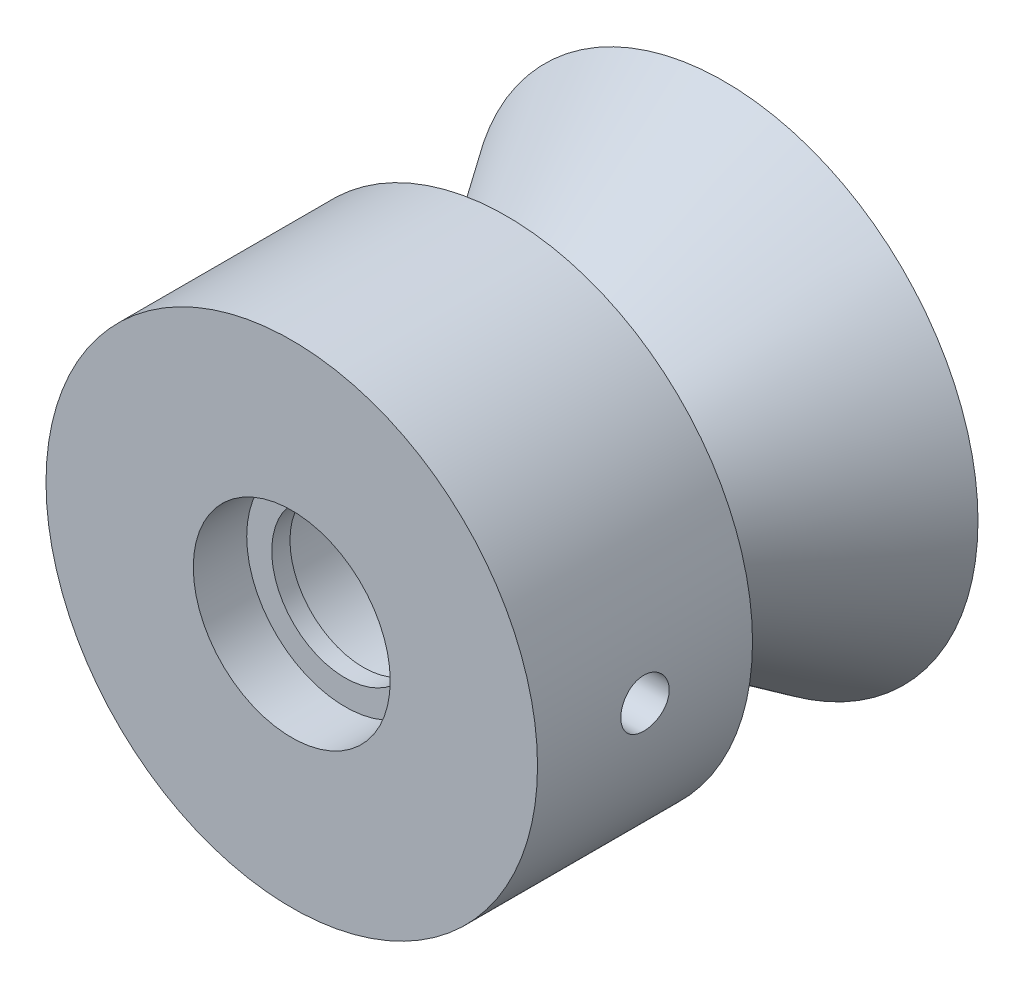
ISO-10303-21;
HEADER;
FILE_DESCRIPTION(('STEP AP214'),'2;1');
FILE_NAME('part.step','',(''),(''),'','','');
FILE_SCHEMA(('AUTOMOTIVE_DESIGN { 1 0 10303 214 1 1 1 1 }'));
ENDSEC;
DATA;
#1=APPLICATION_CONTEXT('core data for automotive mechanical design processes');
#2=APPLICATION_PROTOCOL_DEFINITION('international standard','automotive_design',2000,#1);
#3=PRODUCT_CONTEXT('',#1,'mechanical');
#4=PRODUCT('Part','Part','',(#3));
#5=PRODUCT_RELATED_PRODUCT_CATEGORY('part','',(#4));
#6=PRODUCT_DEFINITION_FORMATION('','',#4);
#7=PRODUCT_DEFINITION_CONTEXT('part definition',#1,'design');
#8=PRODUCT_DEFINITION('design','',#6,#7);
#9=PRODUCT_DEFINITION_SHAPE('','',#8);
#10=(LENGTH_UNIT() NAMED_UNIT(*) SI_UNIT(.MILLI.,.METRE.));
#11=(NAMED_UNIT(*) PLANE_ANGLE_UNIT() SI_UNIT($,.RADIAN.));
#12=(NAMED_UNIT(*) SI_UNIT($,.STERADIAN.) SOLID_ANGLE_UNIT());
#13=UNCERTAINTY_MEASURE_WITH_UNIT(LENGTH_MEASURE(1.E-05),#10,'distance_accuracy_value','');
#14=(GEOMETRIC_REPRESENTATION_CONTEXT(3) GLOBAL_UNCERTAINTY_ASSIGNED_CONTEXT((#13)) GLOBAL_UNIT_ASSIGNED_CONTEXT((#10,
#11,#12)) REPRESENTATION_CONTEXT('',''));
#15=CARTESIAN_POINT('',(0.,0.,0.));
#16=DIRECTION('',(0.,0.,1.));
#17=DIRECTION('',(1.,0.,0.));
#18=AXIS2_PLACEMENT_3D('',#15,#16,#17);
#19=CARTESIAN_POINT('',(0.,0.,-40.));
#20=DIRECTION('',(0.,0.,1.));
#21=DIRECTION('',(1.,0.,0.));
#22=AXIS2_PLACEMENT_3D('',#19,#20,#21);
#23=PLANE('',#22);
#24=CARTESIAN_POINT('',(0.,0.,-40.));
#25=DIRECTION('',(0.,0.,-1.));
#26=DIRECTION('',(-1.,0.,0.));
#27=AXIS2_PLACEMENT_3D('',#24,#25,#26);
#28=CIRCLE('',#27,25.);
#29=CARTESIAN_POINT('',(-25.,0.,-40.));
#30=VERTEX_POINT('',#29);
#31=EDGE_CURVE('E55',#30,#30,#28,.T.);
#32=ORIENTED_EDGE('',*,*,#31,.F.);
#33=EDGE_LOOP('',(#32));
#34=FACE_BOUND('',#33,.T.);
#35=CARTESIAN_POINT('',(0.,0.,-40.));
#36=DIRECTION('',(0.,0.,1.));
#37=DIRECTION('',(1.,0.,0.));
#38=AXIS2_PLACEMENT_3D('',#35,#36,#37);
#39=CIRCLE('',#38,30.9284226358697);
#40=CARTESIAN_POINT('',(30.9284226358697,0.,-40.));
#41=VERTEX_POINT('',#40);
#42=EDGE_CURVE('E47',#41,#41,#39,.T.);
#43=ORIENTED_EDGE('',*,*,#42,.F.);
#44=EDGE_LOOP('',(#43));
#45=FACE_BOUND('',#44,.T.);
#46=ADVANCED_FACE('F41',(#34,#45),#23,.F.);
#47=CARTESIAN_POINT('',(0.,13.,-13.5));
#48=DIRECTION('',(0.,0.,-1.));
#49=DIRECTION('',(-1.,0.,0.));
#50=AXIS2_PLACEMENT_3D('',#47,#48,#49);
#51=PLANE('',#50);
#52=CARTESIAN_POINT('',(0.,0.,-13.5));
#53=DIRECTION('',(0.,0.,-1.));
#54=DIRECTION('',(-1.,0.,0.));
#55=AXIS2_PLACEMENT_3D('',#52,#53,#54);
#56=CIRCLE('',#55,12.0177839569043);
#57=CARTESIAN_POINT('',(-12.0177839569043,0.,-13.5));
#58=VERTEX_POINT('',#57);
#59=EDGE_CURVE('E51',#58,#58,#56,.F.);
#60=ORIENTED_EDGE('',*,*,#59,.F.);
#61=EDGE_LOOP('',(#60));
#62=FACE_BOUND('',#61,.T.);
#63=CARTESIAN_POINT('',(0.,0.,-13.5));
#64=DIRECTION('',(0.,0.,1.));
#65=DIRECTION('',(1.,0.,0.));
#66=AXIS2_PLACEMENT_3D('',#63,#64,#65);
#67=CIRCLE('',#66,13.);
#68=CARTESIAN_POINT('',(13.,0.,-13.5));
#69=VERTEX_POINT('',#68);
#70=EDGE_CURVE('E11',#69,#69,#67,.T.);
#71=ORIENTED_EDGE('',*,*,#70,.T.);
#72=EDGE_LOOP('',(#71));
#73=FACE_BOUND('',#72,.T.);
#74=ADVANCED_FACE('F66',(#62,#73),#51,.F.);
#75=CARTESIAN_POINT('',(0.,0.,-40.));
#76=DIRECTION('',(0.,0.,-1.));
#77=DIRECTION('',(-1.,0.,0.));
#78=AXIS2_PLACEMENT_3D('',#75,#76,#77);
#79=CONICAL_SURFACE('',#78,30.9284226358697,0.594809791942175);
#80=ORIENTED_EDGE('',*,*,#70,.F.);
#81=EDGE_LOOP('',(#80));
#82=FACE_BOUND('',#81,.T.);
#83=ORIENTED_EDGE('',*,*,#42,.T.);
#84=EDGE_LOOP('',(#83));
#85=FACE_BOUND('',#84,.T.);
#86=ADVANCED_FACE('F70',(#82,#85),#79,.T.);
#87=CARTESIAN_POINT('',(0.,0.,-40.));
#88=DIRECTION('',(0.,0.,-1.));
#89=DIRECTION('',(-1.,0.,0.));
#90=AXIS2_PLACEMENT_3D('',#87,#88,#89);
#91=CONICAL_SURFACE('',#90,25.,0.455530934770521);
#92=ORIENTED_EDGE('',*,*,#31,.T.);
#93=EDGE_LOOP('',(#92));
#94=FACE_BOUND('',#93,.T.);
#95=ORIENTED_EDGE('',*,*,#59,.T.);
#96=EDGE_LOOP('',(#95));
#97=FACE_BOUND('',#96,.T.);
#98=ADVANCED_FACE('F61',(#94,#97),#91,.F.);
#99=CLOSED_SHELL('',(#46,#74,#86,#98));
#100=MANIFOLD_SOLID_BREP('B2',#99);
#101=CARTESIAN_POINT('',(0.,0.,12.7));
#102=DIRECTION('',(0.,0.,-1.));
#103=DIRECTION('',(-1.,0.,0.));
#104=AXIS2_PLACEMENT_3D('',#101,#102,#103);
#105=CYLINDRICAL_SURFACE('',#104,29.95);
#106=CARTESIAN_POINT('',(-29.95,0.,2.55));
#107=CARTESIAN_POINT('',(-29.9499981234538,-0.165273198969177,2.54999283663321));
#108=CARTESIAN_POINT('',(-29.9486174171724,-0.330655984335565,2.53606414231987));
#109=CARTESIAN_POINT('',(-29.9432422716075,-0.656837401581663,2.48070961199352));
#110=CARTESIAN_POINT('',(-29.9392449448374,-0.817630764143693,2.43925339814978));
#111=CARTESIAN_POINT('',(-29.9290878326216,-1.12986261212171,2.33006160209786));
#112=CARTESIAN_POINT('',(-29.922929345385,-1.28130664959686,2.26234179386684));
#113=CARTESIAN_POINT('',(-29.9091387350417,-1.57064517462511,2.10257551343268));
#114=CARTESIAN_POINT('',(-29.9015069072115,-1.70854236879884,2.01053391426935));
#115=CARTESIAN_POINT('',(-29.8855948288576,-1.96738830843467,1.80439121074885));
#116=CARTESIAN_POINT('',(-29.8773126369486,-2.08828305174967,1.69022244138537));
#117=CARTESIAN_POINT('',(-29.8610493613784,-2.30922826591523,1.44321043730118));
#118=CARTESIAN_POINT('',(-29.8530682915885,-2.40927777749394,1.310366343636));
#119=CARTESIAN_POINT('',(-29.8382909602838,-2.58588296270166,1.02943767733287));
#120=CARTESIAN_POINT('',(-29.831497168997,-2.66238989976959,0.881322325484443));
#121=CARTESIAN_POINT('',(-29.8198874990029,-2.78942697384979,0.574269121696796));
#122=CARTESIAN_POINT('',(-29.815071572796,-2.83995773470396,0.415331529767507));
#123=CARTESIAN_POINT('',(-29.807980336087,-2.91344829921362,0.0916953649144559));
#124=CARTESIAN_POINT('',(-29.8056967873569,-2.9364975231926,-0.0729827191154579));
#125=CARTESIAN_POINT('',(-29.803903234255,-2.95464712929379,-0.403884671037509));
#126=CARTESIAN_POINT('',(-29.8043931590219,-2.94974822548143,-0.570108499328057));
#127=CARTESIAN_POINT('',(-29.8080836785766,-2.91221436026541,-0.898767403561419));
#128=CARTESIAN_POINT('',(-29.8112747355873,-2.87967698968227,-1.06121374682581));
#129=CARTESIAN_POINT('',(-29.8199930622679,-2.78794163377528,-1.37832860976814));
#130=CARTESIAN_POINT('',(-29.8255203626493,-2.72874329797545,-1.53299702717039));
#131=CARTESIAN_POINT('',(-29.8382993620775,-2.58525856318285,-1.83047411635825));
#132=CARTESIAN_POINT('',(-29.845554036017,-2.50092881898741,-1.97326174808389));
#133=CARTESIAN_POINT('',(-29.8609678230378,-2.30960623610314,-2.24269382595957));
#134=CARTESIAN_POINT('',(-29.8691269617933,-2.20261275399933,-2.36933781363411));
#135=CARTESIAN_POINT('',(-29.8854728399662,-1.96845455567493,-2.60345477511088));
#136=CARTESIAN_POINT('',(-29.8936595482334,-1.84120554925791,-2.71084346408587));
#137=CARTESIAN_POINT('',(-29.9091051543381,-1.57044125854006,-2.90274834025767));
#138=CARTESIAN_POINT('',(-29.916364051182,-1.42692595681713,-2.98726450295641));
#139=CARTESIAN_POINT('',(-29.9291384340144,-1.12764490463304,-3.13102166029559));
#140=CARTESIAN_POINT('',(-29.934653628642,-0.971877112288079,-3.19025843149864));
#141=CARTESIAN_POINT('',(-29.9433161838651,-0.652540056146852,-3.28171378837345));
#142=CARTESIAN_POINT('',(-29.9464636131519,-0.488971018819114,-3.31393315785086));
#143=CARTESIAN_POINT('',(-29.9500271823135,-0.159404572315297,-3.35033231770048));
#144=CARTESIAN_POINT('',(-29.9504546523657,0.0065798726703254,-3.35462842594828));
#145=CARTESIAN_POINT('',(-29.9485605077608,0.336906440048946,-3.33536454119434));
#146=CARTESIAN_POINT('',(-29.9462389291174,0.501248583928275,-3.31180491311341));
#147=CARTESIAN_POINT('',(-29.9391148494679,0.823290148120737,-3.23759481660053));
#148=CARTESIAN_POINT('',(-29.934317331801,0.981002225851254,-3.18699875736127));
#149=CARTESIAN_POINT('',(-29.9227796622852,1.28570010294031,-3.06020791695521));
#150=CARTESIAN_POINT('',(-29.916039468115,1.43268566853407,-2.98401257810147));
#151=CARTESIAN_POINT('',(-29.9013423180945,1.71228438470991,-2.80789724214118));
#152=CARTESIAN_POINT('',(-29.8933814696763,1.84484915104929,-2.70790076080736));
#153=CARTESIAN_POINT('',(-29.877148960267,2.09135360544065,-2.48713141880882));
#154=CARTESIAN_POINT('',(-29.868877291715,2.20529284005068,-2.36635805247394));
#155=CARTESIAN_POINT('',(-29.8529213759889,2.41171530872423,-2.10695599332935));
#156=CARTESIAN_POINT('',(-29.8452392804775,2.50412224553589,-1.96826643504046));
#157=CARTESIAN_POINT('',(-29.8313647949945,2.66433265413678,-1.67726935810627));
#158=CARTESIAN_POINT('',(-29.8251723851783,2.73213645367675,-1.52496202090392));
#159=CARTESIAN_POINT('',(-29.8149916806,2.84108794006098,-1.21131531989358));
#160=CARTESIAN_POINT('',(-29.810999623284,2.88228115130504,-1.04999189708842));
#161=CARTESIAN_POINT('',(-29.8056598313241,2.93698989616469,-0.72267684209016));
#162=CARTESIAN_POINT('',(-29.804312023304,2.95050619779842,-0.556685339563134));
#163=CARTESIAN_POINT('',(-29.8044148271078,2.9494669621254,-0.225504348393906));
#164=CARTESIAN_POINT('',(-29.805853490806,2.93503128034017,-0.0603144668495996));
#165=CARTESIAN_POINT('',(-29.8113416683284,2.87874902162321,0.265281431732011));
#166=CARTESIAN_POINT('',(-29.8153911852042,2.83690241265362,0.425687443177704));
#167=CARTESIAN_POINT('',(-29.8256414912325,2.72701898271585,0.73716219607041));
#168=CARTESIAN_POINT('',(-29.8318420020634,2.65898554999028,0.888232142552192));
#169=CARTESIAN_POINT('',(-29.8456962109654,2.49867214273529,1.17682756444537));
#170=CARTESIAN_POINT('',(-29.8533498994777,2.40639232769185,1.31435312893978));
#171=CARTESIAN_POINT('',(-29.8692873729451,2.19975542937898,1.57257015588149));
#172=CARTESIAN_POINT('',(-29.8775736208457,2.08530907201337,1.69319002674352));
#173=CARTESIAN_POINT('',(-29.8938200596832,1.83776338104265,1.913566436667));
#174=CARTESIAN_POINT('',(-29.901780171968,1.70465958176139,2.01331796658252));
#175=CARTESIAN_POINT('',(-29.9164976211872,1.42322179537678,2.18931716971137));
#176=CARTESIAN_POINT('',(-29.9232519600617,1.27485125242029,2.26550659248562));
#177=CARTESIAN_POINT('',(-29.9347640269232,0.967451655004003,2.39178923726183));
#178=CARTESIAN_POINT('',(-29.939524009198,0.808434871528408,2.44191193889853));
#179=CARTESIAN_POINT('',(-29.9453124792409,0.540428459467774,2.50211409181219));
#180=CARTESIAN_POINT('',(-29.9470621215703,0.433153093430227,2.52004683709761));
#181=CARTESIAN_POINT('',(-29.949406496516,0.217267603551793,2.54399212226637));
#182=CARTESIAN_POINT('',(-29.9500012337196,0.108657485014169,2.55000470949571));
#183=CARTESIAN_POINT('',(-29.95,0.,2.55));
#184=B_SPLINE_CURVE_WITH_KNOTS('',3,(#106,#107,#108,#109,#110,#111,#112,#113,#114,#115,#116,
#117,#118,#119,#120,#121,#122,#123,#124,#125,#126,#127,#128,#129,#130,#131,#132,#133,#134,#135,
#136,#137,#138,#139,#140,#141,#142,#143,#144,#145,#146,#147,#148,#149,#150,#151,#152,#153,#154,
#155,#156,#157,#158,#159,#160,#161,#162,#163,#164,#165,#166,#167,#168,#169,#170,#171,#172,#173,
#174,#175,#176,#177,#178,#179,#180,#181,#182,#183),.UNSPECIFIED.,.T.,.F.,(4,2,2,2,2,2,2,2,2,2,2,
2,2,2,2,2,2,2,2,2,2,2,2,2,2,2,2,2,2,2,2,2,2,2,2,2,2,2,4),(0.,0.495422826025754,
0.991393283603082,1.48706632030608,1.98264012067271,2.4797540065436,2.97689076393199,
3.47504984884633,3.97319696945041,4.4697187402387,4.9662278251164,5.46099100024599,
5.95576067955385,6.45138869703066,6.94703078708645,7.44479209567091,7.94255393739047,
8.44039890784106,8.93822943474167,9.43398484926674,9.929733769278,10.4244887610754,
10.9192545319374,11.4156322085922,11.9120219678522,12.4101447524184,12.9082609009977,
13.4055226183982,13.9027705368882,14.3978910231652,14.8930120881396,15.3880691122555,
15.8831228801048,16.380213532545,16.877423367908,17.375852760621,17.8737172320494,
18.199430127098,18.5251417284364),.UNSPECIFIED.);
#185=CARTESIAN_POINT('',(-29.95,0.,2.55));
#186=VERTEX_POINT('',#185);
#187=EDGE_CURVE('E113',#186,#186,#184,.T.);
#188=ORIENTED_EDGE('',*,*,#187,.T.);
#189=EDGE_LOOP('',(#188));
#190=FACE_BOUND('',#189,.T.);
#191=CARTESIAN_POINT('',(0.,0.,12.7));
#192=DIRECTION('',(0.,0.,1.));
#193=DIRECTION('',(1.,0.,0.));
#194=AXIS2_PLACEMENT_3D('',#191,#192,#193);
#195=CIRCLE('',#194,29.95);
#196=CARTESIAN_POINT('',(29.95,0.,12.7));
#197=VERTEX_POINT('',#196);
#198=EDGE_CURVE('E121',#197,#197,#195,.T.);
#199=ORIENTED_EDGE('',*,*,#198,.F.);
#200=EDGE_LOOP('',(#199));
#201=FACE_BOUND('',#200,.T.);
#202=CARTESIAN_POINT('',(0.,0.,-13.5));
#203=DIRECTION('',(0.,0.,-1.));
#204=DIRECTION('',(-1.,0.,0.));
#205=AXIS2_PLACEMENT_3D('',#202,#203,#204);
#206=CIRCLE('',#205,29.95);
#207=CARTESIAN_POINT('',(-29.95,0.,-13.5));
#208=VERTEX_POINT('',#207);
#209=EDGE_CURVE('E174',#208,#208,#206,.T.);
#210=ORIENTED_EDGE('',*,*,#209,.F.);
#211=EDGE_LOOP('',(#210));
#212=FACE_BOUND('',#211,.T.);
#213=CARTESIAN_POINT('',(29.95,0.,-3.35));
#214=CARTESIAN_POINT('',(29.9499981234538,0.165273198969177,-3.3499928366332));
#215=CARTESIAN_POINT('',(29.9486174171724,0.330655984335565,-3.33606414231987));
#216=CARTESIAN_POINT('',(29.9432422716075,0.656837401581663,-3.28070961199352));
#217=CARTESIAN_POINT('',(29.9392449448374,0.817630764143693,-3.23925339814978));
#218=CARTESIAN_POINT('',(29.9290878326216,1.12986261212171,-3.13006160209786));
#219=CARTESIAN_POINT('',(29.922929345385,1.28130664959685,-3.06234179386684));
#220=CARTESIAN_POINT('',(29.9091387350417,1.57064517462511,-2.90257551343267));
#221=CARTESIAN_POINT('',(29.9015069072115,1.70854236879884,-2.81053391426934));
#222=CARTESIAN_POINT('',(29.8855948288576,1.96738830843467,-2.60439121074884));
#223=CARTESIAN_POINT('',(29.8773126369486,2.08828305174967,-2.49022244138536));
#224=CARTESIAN_POINT('',(29.8610493613784,2.30922826591523,-2.24321043730118));
#225=CARTESIAN_POINT('',(29.8530682915885,2.40927777749394,-2.110366343636));
#226=CARTESIAN_POINT('',(29.8382909602838,2.58588296270166,-1.82943767733286));
#227=CARTESIAN_POINT('',(29.831497168997,2.66238989976959,-1.68132232548444));
#228=CARTESIAN_POINT('',(29.8198874990029,2.78942697384979,-1.37426912169679));
#229=CARTESIAN_POINT('',(29.815071572796,2.83995773470396,-1.2153315297675));
#230=CARTESIAN_POINT('',(29.807980336087,2.91344829921362,-0.89169536491445));
#231=CARTESIAN_POINT('',(29.8056967873569,2.9364975231926,-0.727017280884537));
#232=CARTESIAN_POINT('',(29.803903234255,2.95464712929378,-0.396115328962486));
#233=CARTESIAN_POINT('',(29.8043931590219,2.94974822548143,-0.229891500671938));
#234=CARTESIAN_POINT('',(29.8080836785766,2.91221436026541,0.098767403561424));
#235=CARTESIAN_POINT('',(29.8112747355873,2.87967698968227,0.261213746825815));
#236=CARTESIAN_POINT('',(29.8199930622679,2.78794163377528,0.578328609768142));
#237=CARTESIAN_POINT('',(29.8255203626493,2.72874329797545,0.732997027170395));
#238=CARTESIAN_POINT('',(29.8382993620775,2.58525856318285,1.03047411635826));
#239=CARTESIAN_POINT('',(29.845554036017,2.5009288189874,1.1732617480839));
#240=CARTESIAN_POINT('',(29.8609678230378,2.30960623610314,1.44269382595958));
#241=CARTESIAN_POINT('',(29.8691269617933,2.20261275399933,1.56933781363411));
#242=CARTESIAN_POINT('',(29.8854728399662,1.96845455567493,1.80345477511089));
#243=CARTESIAN_POINT('',(29.8936595482334,1.84120554925791,1.91084346408587));
#244=CARTESIAN_POINT('',(29.9091051543381,1.57044125854006,2.10274834025767));
#245=CARTESIAN_POINT('',(29.916364051182,1.42692595681713,2.18726450295641));
#246=CARTESIAN_POINT('',(29.9291384340144,1.12764490463304,2.3310216602956));
#247=CARTESIAN_POINT('',(29.934653628642,0.971877112288078,2.39025843149864));
#248=CARTESIAN_POINT('',(29.9433161838651,0.652540056146851,2.48171378837346));
#249=CARTESIAN_POINT('',(29.9464636131519,0.488971018819113,2.51393315785087));
#250=CARTESIAN_POINT('',(29.9500271823135,0.159404572315295,2.55033231770048));
#251=CARTESIAN_POINT('',(29.9504546523657,-0.00657987267032675,2.55462842594829));
#252=CARTESIAN_POINT('',(29.9485605077608,-0.336906440048947,2.53536454119435));
#253=CARTESIAN_POINT('',(29.9462389291174,-0.501248583928276,2.51180491311342));
#254=CARTESIAN_POINT('',(29.9391148494679,-0.823290148120739,2.43759481660053));
#255=CARTESIAN_POINT('',(29.934317331801,-0.981002225851256,2.38699875736127));
#256=CARTESIAN_POINT('',(29.9227796622852,-1.28570010294031,2.26020791695521));
#257=CARTESIAN_POINT('',(29.916039468115,-1.43268566853408,2.18401257810148));
#258=CARTESIAN_POINT('',(29.9013423180945,-1.71228438470991,2.00789724214118));
#259=CARTESIAN_POINT('',(29.8933814696763,-1.84484915104929,1.90790076080736));
#260=CARTESIAN_POINT('',(29.877148960267,-2.09135360544065,1.68713141880882));
#261=CARTESIAN_POINT('',(29.868877291715,-2.20529284005068,1.56635805247394));
#262=CARTESIAN_POINT('',(29.8529213759889,-2.41171530872423,1.30695599332936));
#263=CARTESIAN_POINT('',(29.8452392804775,-2.50412224553589,1.16826643504047));
#264=CARTESIAN_POINT('',(29.8313647949945,-2.66433265413679,0.877269358106274));
#265=CARTESIAN_POINT('',(29.8251723851783,-2.73213645367675,0.724962020903921));
#266=CARTESIAN_POINT('',(29.8149916806,-2.84108794006098,0.411315319893579));
#267=CARTESIAN_POINT('',(29.810999623284,-2.88228115130504,0.249991897088423));
#268=CARTESIAN_POINT('',(29.8056598313241,-2.93698989616469,-0.0773231579098366));
#269=CARTESIAN_POINT('',(29.804312023304,-2.95050619779842,-0.243314660436863));
#270=CARTESIAN_POINT('',(29.8044148271078,-2.9494669621254,-0.57449565160609));
#271=CARTESIAN_POINT('',(29.805853490806,-2.93503128034017,-0.739685533150397));
#272=CARTESIAN_POINT('',(29.8113416683284,-2.87874902162321,-1.06528143173201));
#273=CARTESIAN_POINT('',(29.8153911852042,-2.83690241265362,-1.2256874431777));
#274=CARTESIAN_POINT('',(29.8256414912325,-2.72701898271585,-1.53716219607041));
#275=CARTESIAN_POINT('',(29.8318420020634,-2.65898554999028,-1.68823214255219));
#276=CARTESIAN_POINT('',(29.8456962109654,-2.49867214273529,-1.97682756444537));
#277=CARTESIAN_POINT('',(29.8533498994777,-2.40639232769185,-2.11435312893978));
#278=CARTESIAN_POINT('',(29.8692873729451,-2.19975542937898,-2.37257015588149));
#279=CARTESIAN_POINT('',(29.8775736208457,-2.08530907201337,-2.49319002674352));
#280=CARTESIAN_POINT('',(29.8938200596832,-1.83776338104265,-2.713566436667));
#281=CARTESIAN_POINT('',(29.901780171968,-1.70465958176138,-2.81331796658252));
#282=CARTESIAN_POINT('',(29.9164976211872,-1.42322179537678,-2.98931716971136));
#283=CARTESIAN_POINT('',(29.9232519600616,-1.27485125242029,-3.06550659248562));
#284=CARTESIAN_POINT('',(29.9347640269232,-0.967451655004001,-3.19178923726183));
#285=CARTESIAN_POINT('',(29.939524009198,-0.808434871528406,-3.24191193889852));
#286=CARTESIAN_POINT('',(29.9453124792409,-0.540428459467772,-3.30211409181219));
#287=CARTESIAN_POINT('',(29.9470621215703,-0.433153093430224,-3.32004683709761));
#288=CARTESIAN_POINT('',(29.949406496516,-0.217267603551791,-3.34399212226637));
#289=CARTESIAN_POINT('',(29.9500012337196,-0.108657485014168,-3.3500047094957));
#290=CARTESIAN_POINT('',(29.95,0.,-3.35));
#291=B_SPLINE_CURVE_WITH_KNOTS('',3,(#213,#214,#215,#216,#217,#218,#219,#220,#221,#222,#223,
#224,#225,#226,#227,#228,#229,#230,#231,#232,#233,#234,#235,#236,#237,#238,#239,#240,#241,#242,
#243,#244,#245,#246,#247,#248,#249,#250,#251,#252,#253,#254,#255,#256,#257,#258,#259,#260,#261,
#262,#263,#264,#265,#266,#267,#268,#269,#270,#271,#272,#273,#274,#275,#276,#277,#278,#279,#280,
#281,#282,#283,#284,#285,#286,#287,#288,#289,#290),.UNSPECIFIED.,.T.,.F.,(4,2,2,2,2,2,2,2,2,2,2,
2,2,2,2,2,2,2,2,2,2,2,2,2,2,2,2,2,2,2,2,2,2,2,2,2,2,2,4),(0.,0.495422826025754,
0.991393283603082,1.48706632030608,1.98264012067271,2.4797540065436,2.97689076393199,
3.47504984884633,3.97319696945041,4.4697187402387,4.9662278251164,5.46099100024599,
5.95576067955385,6.45138869703066,6.94703078708645,7.4447920956709,7.94255393739047,
8.44039890784106,8.93822943474167,9.43398484926674,9.929733769278,10.4244887610754,
10.9192545319374,11.4156322085922,11.9120219678522,12.4101447524184,12.9082609009977,
13.4055226183982,13.9027705368882,14.3978910231652,14.8930120881396,15.3880691122555,
15.8831228801048,16.380213532545,16.877423367908,17.375852760621,17.8737172320494,
18.199430127098,18.5251417284364),.UNSPECIFIED.);
#292=CARTESIAN_POINT('',(29.95,0.,-3.35));
#293=VERTEX_POINT('',#292);
#294=EDGE_CURVE('E40',#293,#293,#291,.T.);
#295=ORIENTED_EDGE('',*,*,#294,.F.);
#296=EDGE_LOOP('',(#295));
#297=FACE_BOUND('',#296,.T.);
#298=ADVANCED_FACE('F103',(#190,#201,#212,#297),#105,.T.);
#299=CARTESIAN_POINT('',(0.,0.,12.7));
#300=DIRECTION('',(0.,0.,-1.));
#301=DIRECTION('',(-1.,0.,0.));
#302=AXIS2_PLACEMENT_3D('',#299,#300,#301);
#303=CYLINDRICAL_SURFACE('',#302,12.);
#304=CARTESIAN_POINT('',(0.,0.,12.7));
#305=DIRECTION('',(0.,0.,-1.));
#306=DIRECTION('',(-1.,0.,0.));
#307=AXIS2_PLACEMENT_3D('',#304,#305,#306);
#308=CIRCLE('',#307,12.);
#309=CARTESIAN_POINT('',(-12.,0.,12.7));
#310=VERTEX_POINT('',#309);
#311=EDGE_CURVE('E188',#310,#310,#308,.T.);
#312=ORIENTED_EDGE('',*,*,#311,.F.);
#313=EDGE_LOOP('',(#312));
#314=FACE_BOUND('',#313,.T.);
#315=CARTESIAN_POINT('',(0.,0.,6.19125));
#316=DIRECTION('',(0.,0.,-1.));
#317=DIRECTION('',(-1.,0.,0.));
#318=AXIS2_PLACEMENT_3D('',#315,#316,#317);
#319=CIRCLE('',#318,12.);
#320=CARTESIAN_POINT('',(-12.,0.,6.19125));
#321=VERTEX_POINT('',#320);
#322=EDGE_CURVE('E117',#321,#321,#319,.F.);
#323=ORIENTED_EDGE('',*,*,#322,.F.);
#324=EDGE_LOOP('',(#323));
#325=FACE_BOUND('',#324,.T.);
#326=ADVANCED_FACE('F155',(#314,#325),#303,.F.);
#327=CARTESIAN_POINT('',(0.,0.,12.7));
#328=DIRECTION('',(0.,0.,1.));
#329=DIRECTION('',(1.,0.,0.));
#330=AXIS2_PLACEMENT_3D('',#327,#328,#329);
#331=PLANE('',#330);
#332=ORIENTED_EDGE('',*,*,#311,.T.);
#333=EDGE_LOOP('',(#332));
#334=FACE_BOUND('',#333,.T.);
#335=ORIENTED_EDGE('',*,*,#198,.T.);
#336=EDGE_LOOP('',(#335));
#337=FACE_BOUND('',#336,.T.);
#338=ADVANCED_FACE('F153',(#334,#337),#331,.T.);
#339=CARTESIAN_POINT('',(0.,0.,3.96875));
#340=DIRECTION('',(0.,0.,-1.));
#341=DIRECTION('',(-1.,0.,0.));
#342=AXIS2_PLACEMENT_3D('',#339,#340,#341);
#343=CIRCLE('',#342,12.);
#344=CARTESIAN_POINT('',(-12.,0.,3.96875));
#345=VERTEX_POINT('',#344);
#346=EDGE_CURVE('E185',#345,#345,#343,.T.);
#347=ORIENTED_EDGE('',*,*,#346,.F.);
#348=EDGE_LOOP('',(#347));
#349=FACE_BOUND('',#348,.T.);
#350=CARTESIAN_POINT('',(0.,0.,-13.5));
#351=DIRECTION('',(0.,0.,-1.));
#352=DIRECTION('',(-1.,0.,0.));
#353=AXIS2_PLACEMENT_3D('',#350,#351,#352);
#354=CIRCLE('',#353,12.);
#355=CARTESIAN_POINT('',(-12.,0.,-13.5));
#356=VERTEX_POINT('',#355);
#357=EDGE_CURVE('E176',#356,#356,#354,.T.);
#358=ORIENTED_EDGE('',*,*,#357,.T.);
#359=EDGE_LOOP('',(#358));
#360=FACE_BOUND('',#359,.T.);
#361=ADVANCED_FACE('F150',(#349,#360),#303,.F.);
#362=CARTESIAN_POINT('',(0.,0.,3.96875));
#363=DIRECTION('',(0.,0.,-1.));
#364=DIRECTION('',(-1.,0.,0.));
#365=AXIS2_PLACEMENT_3D('',#362,#363,#364);
#366=PLANE('',#365);
#367=CARTESIAN_POINT('',(0.,0.,3.96875));
#368=DIRECTION('',(0.,0.,-1.));
#369=DIRECTION('',(-1.,0.,0.));
#370=AXIS2_PLACEMENT_3D('',#367,#368,#369);
#371=CIRCLE('',#370,8.95);
#372=CARTESIAN_POINT('',(-8.95,0.,3.96875));
#373=VERTEX_POINT('',#372);
#374=EDGE_CURVE('E127',#373,#373,#371,.T.);
#375=ORIENTED_EDGE('',*,*,#374,.F.);
#376=EDGE_LOOP('',(#375));
#377=FACE_BOUND('',#376,.T.);
#378=ORIENTED_EDGE('',*,*,#346,.T.);
#379=EDGE_LOOP('',(#378));
#380=FACE_BOUND('',#379,.T.);
#381=ADVANCED_FACE('F146',(#377,#380),#366,.T.);
#382=CARTESIAN_POINT('',(0.,0.,6.19125));
#383=DIRECTION('',(0.,0.,-1.));
#384=DIRECTION('',(-1.,0.,0.));
#385=AXIS2_PLACEMENT_3D('',#382,#383,#384);
#386=PLANE('',#385);
#387=CARTESIAN_POINT('',(0.,0.,6.19125));
#388=DIRECTION('',(0.,0.,1.));
#389=DIRECTION('',(1.,0.,0.));
#390=AXIS2_PLACEMENT_3D('',#387,#388,#389);
#391=CIRCLE('',#390,8.95);
#392=CARTESIAN_POINT('',(8.95,0.,6.19125));
#393=VERTEX_POINT('',#392);
#394=EDGE_CURVE('E175',#393,#393,#391,.T.);
#395=ORIENTED_EDGE('',*,*,#394,.F.);
#396=EDGE_LOOP('',(#395));
#397=FACE_BOUND('',#396,.T.);
#398=ORIENTED_EDGE('',*,*,#322,.T.);
#399=EDGE_LOOP('',(#398));
#400=FACE_BOUND('',#399,.T.);
#401=ADVANCED_FACE('F142',(#397,#400),#386,.F.);
#402=CARTESIAN_POINT('',(0.,0.,0.));
#403=DIRECTION('',(0.,0.,1.));
#404=DIRECTION('',(1.,0.,0.));
#405=AXIS2_PLACEMENT_3D('',#402,#403,#404);
#406=CYLINDRICAL_SURFACE('',#405,8.95);
#407=ORIENTED_EDGE('',*,*,#374,.T.);
#408=EDGE_LOOP('',(#407));
#409=FACE_BOUND('',#408,.T.);
#410=ORIENTED_EDGE('',*,*,#394,.T.);
#411=EDGE_LOOP('',(#410));
#412=FACE_BOUND('',#411,.T.);
#413=ADVANCED_FACE('F138',(#409,#412),#406,.F.);
#414=CARTESIAN_POINT('',(0.,0.,-13.5));
#415=DIRECTION('',(0.,0.,-1.));
#416=DIRECTION('',(-1.,0.,0.));
#417=AXIS2_PLACEMENT_3D('',#414,#415,#416);
#418=PLANE('',#417);
#419=ORIENTED_EDGE('',*,*,#209,.T.);
#420=EDGE_LOOP('',(#419));
#421=FACE_BOUND('',#420,.T.);
#422=ORIENTED_EDGE('',*,*,#357,.F.);
#423=EDGE_LOOP('',(#422));
#424=FACE_BOUND('',#423,.T.);
#425=ADVANCED_FACE('F134',(#421,#424),#418,.T.);
#426=CARTESIAN_POINT('',(-20.95,0.,-0.399999999999998));
#427=DIRECTION('',(-1.,0.,0.));
#428=DIRECTION('',(0.,0.,1.));
#429=AXIS2_PLACEMENT_3D('',#426,#427,#428);
#430=CYLINDRICAL_SURFACE('',#429,2.95);
#431=CARTESIAN_POINT('',(-20.95,0.,-0.399999999999998));
#432=DIRECTION('',(-1.,0.,0.));
#433=DIRECTION('',(0.,0.,1.));
#434=AXIS2_PLACEMENT_3D('',#431,#432,#433);
#435=CIRCLE('',#434,2.95);
#436=CARTESIAN_POINT('',(-20.95,0.,2.55));
#437=VERTEX_POINT('',#436);
#438=EDGE_CURVE('E181',#437,#437,#435,.T.);
#439=ORIENTED_EDGE('',*,*,#438,.F.);
#440=EDGE_LOOP('',(#439));
#441=FACE_BOUND('',#440,.T.);
#442=ORIENTED_EDGE('',*,*,#187,.F.);
#443=EDGE_LOOP('',(#442));
#444=FACE_BOUND('',#443,.T.);
#445=ADVANCED_FACE('F128',(#441,#444),#430,.F.);
#446=CARTESIAN_POINT('',(-20.95,0.,-0.399999999999998));
#447=DIRECTION('',(-1.,0.,0.));
#448=DIRECTION('',(0.,0.,1.));
#449=AXIS2_PLACEMENT_3D('',#446,#447,#448);
#450=PLANE('',#449);
#451=ORIENTED_EDGE('',*,*,#438,.T.);
#452=EDGE_LOOP('',(#451));
#453=FACE_BOUND('',#452,.T.);
#454=ADVANCED_FACE('F133',(#453),#450,.T.);
#455=CARTESIAN_POINT('',(20.95,0.,-0.399999999999998));
#456=DIRECTION('',(1.,0.,0.));
#457=DIRECTION('',(0.,0.,-1.));
#458=AXIS2_PLACEMENT_3D('',#455,#456,#457);
#459=CYLINDRICAL_SURFACE('',#458,2.95);
#460=CARTESIAN_POINT('',(20.95,0.,-0.399999999999998));
#461=DIRECTION('',(-1.,0.,0.));
#462=DIRECTION('',(0.,0.,1.));
#463=AXIS2_PLACEMENT_3D('',#460,#461,#462);
#464=CIRCLE('',#463,2.95);
#465=CARTESIAN_POINT('',(20.95,0.,2.55));
#466=VERTEX_POINT('',#465);
#467=EDGE_CURVE('E205',#466,#466,#464,.T.);
#468=ORIENTED_EDGE('',*,*,#467,.T.);
#469=EDGE_LOOP('',(#468));
#470=FACE_BOUND('',#469,.T.);
#471=ORIENTED_EDGE('',*,*,#294,.T.);
#472=EDGE_LOOP('',(#471));
#473=FACE_BOUND('',#472,.T.);
#474=ADVANCED_FACE('F209',(#470,#473),#459,.F.);
#475=CARTESIAN_POINT('',(20.95,0.,-0.399999999999998));
#476=DIRECTION('',(1.,0.,0.));
#477=DIRECTION('',(0.,0.,1.));
#478=AXIS2_PLACEMENT_3D('',#475,#476,#477);
#479=PLANE('',#478);
#480=ORIENTED_EDGE('',*,*,#467,.F.);
#481=EDGE_LOOP('',(#480));
#482=FACE_BOUND('',#481,.T.);
#483=ADVANCED_FACE('F211',(#482),#479,.T.);
#484=CLOSED_SHELL('',(#298,#326,#338,#361,#381,#401,#413,#425,#445,#454,#474,#483));
#485=MANIFOLD_SOLID_BREP('B6',#484);
#486=ADVANCED_BREP_SHAPE_REPRESENTATION('',(#18,#100,#485),#14);
#487=SHAPE_DEFINITION_REPRESENTATION(#9,#486);
ENDSEC;
END-ISO-10303-21;
